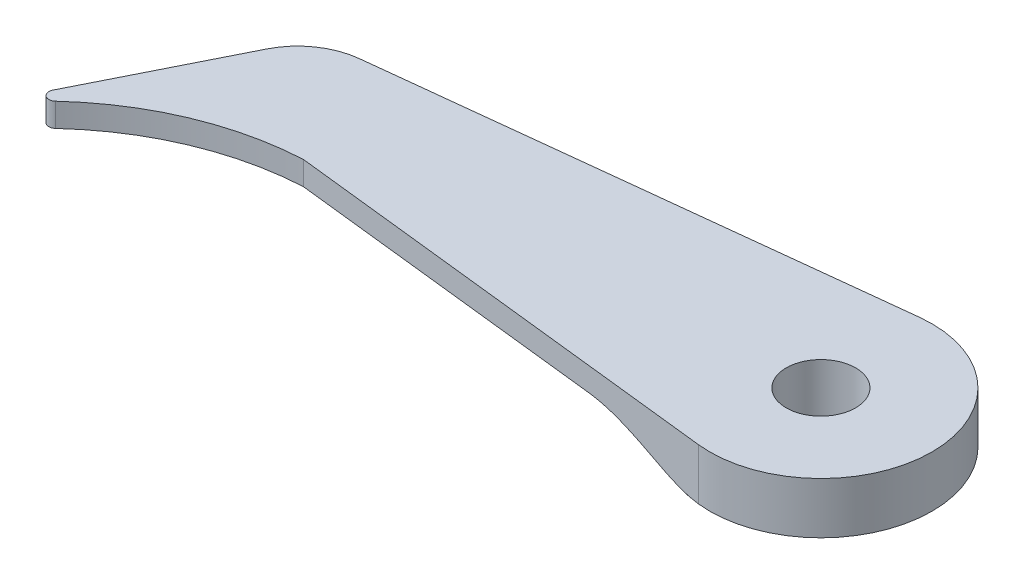
ISO-10303-21;
HEADER;
FILE_DESCRIPTION(('STEP AP214'),'2;1');
FILE_NAME('part.step','',(''),(''),'','','');
FILE_SCHEMA(('AUTOMOTIVE_DESIGN { 1 0 10303 214 1 1 1 1 }'));
ENDSEC;
DATA;
#1=APPLICATION_CONTEXT('core data for automotive mechanical design processes');
#2=APPLICATION_PROTOCOL_DEFINITION('international standard','automotive_design',2000,#1);
#3=PRODUCT_CONTEXT('',#1,'mechanical');
#4=PRODUCT('Part','Part','',(#3));
#5=PRODUCT_RELATED_PRODUCT_CATEGORY('part','',(#4));
#6=PRODUCT_DEFINITION_FORMATION('','',#4);
#7=PRODUCT_DEFINITION_CONTEXT('part definition',#1,'design');
#8=PRODUCT_DEFINITION('design','',#6,#7);
#9=PRODUCT_DEFINITION_SHAPE('','',#8);
#10=(LENGTH_UNIT() NAMED_UNIT(*) SI_UNIT(.MILLI.,.METRE.));
#11=(NAMED_UNIT(*) PLANE_ANGLE_UNIT() SI_UNIT($,.RADIAN.));
#12=(NAMED_UNIT(*) SI_UNIT($,.STERADIAN.) SOLID_ANGLE_UNIT());
#13=UNCERTAINTY_MEASURE_WITH_UNIT(LENGTH_MEASURE(1.E-05),#10,'distance_accuracy_value','');
#14=(GEOMETRIC_REPRESENTATION_CONTEXT(3) GLOBAL_UNCERTAINTY_ASSIGNED_CONTEXT((#13)) GLOBAL_UNIT_ASSIGNED_CONTEXT((#10,
#11,#12)) REPRESENTATION_CONTEXT('',''));
#15=CARTESIAN_POINT('',(0.,0.,0.));
#16=DIRECTION('',(0.,0.,1.));
#17=DIRECTION('',(1.,0.,0.));
#18=AXIS2_PLACEMENT_3D('',#15,#16,#17);
#19=CARTESIAN_POINT('',(0.,-4.699,0.));
#20=DIRECTION('',(0.,1.,0.));
#21=DIRECTION('',(0.,0.,1.));
#22=AXIS2_PLACEMENT_3D('',#19,#20,#21);
#23=CYLINDRICAL_SURFACE('',#22,10.16);
#24=DIRECTION('',(0.,1.,0.));
#25=VECTOR('',#24,1.);
#26=CARTESIAN_POINT('',(-1.12380115118108,-2.159,10.097656707009));
#27=LINE('',#26,#25);
#28=CARTESIAN_POINT('',(-1.12380115118108,-4.699,10.097656707009));
#29=VERTEX_POINT('',#28);
#30=CARTESIAN_POINT('',(-1.12380115118107,0.,10.097656707009));
#31=VERTEX_POINT('',#30);
#32=EDGE_CURVE('E132',#29,#31,#27,.T.);
#33=ORIENTED_EDGE('',*,*,#32,.F.);
#34=CARTESIAN_POINT('',(0.,-4.699,0.));
#35=DIRECTION('',(0.,1.,0.));
#36=DIRECTION('',(0.,0.,1.));
#37=AXIS2_PLACEMENT_3D('',#34,#35,#36);
#38=CIRCLE('',#37,10.16);
#39=CARTESIAN_POINT('',(-1.12380115118108,-4.699,-10.097656707009));
#40=VERTEX_POINT('',#39);
#41=EDGE_CURVE('E167',#29,#40,#38,.T.);
#42=ORIENTED_EDGE('',*,*,#41,.T.);
#43=DIRECTION('',(0.,1.,0.));
#44=VECTOR('',#43,1.);
#45=CARTESIAN_POINT('',(-1.12380115118108,-2.159,-10.097656707009));
#46=LINE('',#45,#44);
#47=CARTESIAN_POINT('',(-1.12380115118108,0.,-10.097656707009));
#48=VERTEX_POINT('',#47);
#49=EDGE_CURVE('E133',#40,#48,#46,.T.);
#50=ORIENTED_EDGE('',*,*,#49,.T.);
#51=CARTESIAN_POINT('',(0.,0.,0.));
#52=DIRECTION('',(0.,1.,0.));
#53=DIRECTION('',(0.,0.,1.));
#54=AXIS2_PLACEMENT_3D('',#51,#52,#53);
#55=CIRCLE('',#54,10.16);
#56=EDGE_CURVE('E161',#31,#48,#55,.T.);
#57=ORIENTED_EDGE('',*,*,#56,.F.);
#58=EDGE_LOOP('',(#33,#42,#50,#57));
#59=FACE_BOUND('',#58,.T.);
#60=ADVANCED_FACE('F45',(#59),#23,.T.);
#61=CARTESIAN_POINT('',(0.,-4.699,0.));
#62=DIRECTION('',(0.,1.,0.));
#63=DIRECTION('',(0.,0.,1.));
#64=AXIS2_PLACEMENT_3D('',#61,#62,#63);
#65=PLANE('',#64);
#66=CARTESIAN_POINT('',(0.,-4.699,0.));
#67=DIRECTION('',(0.,-1.,0.));
#68=DIRECTION('',(0.,0.,-1.));
#69=AXIS2_PLACEMENT_3D('',#66,#67,#68);
#70=CIRCLE('',#69,3.175);
#71=CARTESIAN_POINT('',(0.,-4.699,-3.175));
#72=VERTEX_POINT('',#71);
#73=EDGE_CURVE('E273',#72,#72,#70,.T.);
#74=ORIENTED_EDGE('',*,*,#73,.F.);
#75=EDGE_LOOP('',(#74));
#76=FACE_BOUND('',#75,.T.);
#77=EDGE_CURVE('E163',#40,#29,#38,.T.);
#78=ORIENTED_EDGE('',*,*,#77,.F.);
#79=ORIENTED_EDGE('',*,*,#41,.F.);
#80=EDGE_LOOP('',(#78,#79));
#81=FACE_BOUND('',#80,.T.);
#82=ADVANCED_FACE('F207',(#76,#81),#65,.F.);
#83=CARTESIAN_POINT('',(0.,0.,0.));
#84=DIRECTION('',(0.,1.,0.));
#85=DIRECTION('',(0.,0.,1.));
#86=AXIS2_PLACEMENT_3D('',#83,#84,#85);
#87=PLANE('',#86);
#88=CARTESIAN_POINT('',(0.,0.,0.));
#89=DIRECTION('',(0.,-1.,0.));
#90=DIRECTION('',(0.,0.,-1.));
#91=AXIS2_PLACEMENT_3D('',#88,#89,#90);
#92=CIRCLE('',#91,3.175);
#93=CARTESIAN_POINT('',(0.,0.,-3.175));
#94=VERTEX_POINT('',#93);
#95=EDGE_CURVE('E151',#94,#94,#92,.T.);
#96=ORIENTED_EDGE('',*,*,#95,.T.);
#97=EDGE_LOOP('',(#96));
#98=FACE_BOUND('',#97,.T.);
#99=DIRECTION('',(-0.993863849115061,0.,0.110610349525696));
#100=VECTOR('',#99,1.);
#101=CARTESIAN_POINT('',(-1.12380115118107,0.,-10.097656707009));
#102=LINE('',#101,#100);
#103=CARTESIAN_POINT('',(-47.2211640746857,0.,-4.96733082814572));
#104=VERTEX_POINT('',#103);
#105=EDGE_CURVE('E147',#48,#104,#102,.T.);
#106=ORIENTED_EDGE('',*,*,#105,.T.);
#107=CARTESIAN_POINT('',(-46.5187883551975,0.,1.34370461373491));
#108=DIRECTION('',(0.,1.,0.));
#109=DIRECTION('',(0.,0.,1.));
#110=AXIS2_PLACEMENT_3D('',#107,#108,#109);
#111=CIRCLE('',#110,6.35);
#112=CARTESIAN_POINT('',(-52.198401018047,0.,-1.49610171768982));
#113=VERTEX_POINT('',#112);
#114=EDGE_CURVE('E68',#104,#113,#111,.T.);
#115=ORIENTED_EDGE('',*,*,#114,.T.);
#116=DIRECTION('',(-0.447213595499958,0.,0.894427190999916));
#117=VECTOR('',#116,1.);
#118=CARTESIAN_POINT('',(-42.3571615015135,0.,-21.1785807507568));
#119=LINE('',#118,#117);
#120=CARTESIAN_POINT('',(-58.721971796448,0.,11.5510398391123));
#121=VERTEX_POINT('',#120);
#122=EDGE_CURVE('E150',#113,#121,#119,.T.);
#123=ORIENTED_EDGE('',*,*,#122,.T.);
#124=CARTESIAN_POINT('',(-58.1540105301631,0.,11.8350204722548));
#125=DIRECTION('',(0.,1.,0.));
#126=DIRECTION('',(0.,0.,1.));
#127=AXIS2_PLACEMENT_3D('',#124,#125,#126);
#128=CIRCLE('',#127,0.635);
#129=CARTESIAN_POINT('',(-57.7226707194551,0.,12.3010365317403));
#130=VERTEX_POINT('',#129);
#131=EDGE_CURVE('E230',#121,#130,#128,.T.);
#132=ORIENTED_EDGE('',*,*,#131,.T.);
#133=CARTESIAN_POINT('',(-40.4690782911367,0.,30.9416789111615));
#134=DIRECTION('',(0.,1.,0.));
#135=DIRECTION('',(0.,0.,1.));
#136=AXIS2_PLACEMENT_3D('',#133,#134,#135);
#137=CIRCLE('',#136,25.4);
#138=CARTESIAN_POINT('',(-41.7638011511811,0.,5.57469854857835));
#139=VERTEX_POINT('',#138);
#140=EDGE_CURVE('E154',#130,#139,#137,.F.);
#141=ORIENTED_EDGE('',*,*,#140,.T.);
#142=DIRECTION('',(0.99386384911506,0.,0.110610349525696));
#143=VECTOR('',#142,1.);
#144=CARTESIAN_POINT('',(-1.12380115118107,0.,10.097656707009));
#145=LINE('',#144,#143);
#146=EDGE_CURVE('E130',#139,#31,#145,.T.);
#147=ORIENTED_EDGE('',*,*,#146,.T.);
#148=ORIENTED_EDGE('',*,*,#56,.T.);
#149=EDGE_LOOP('',(#106,#115,#123,#132,#141,#147,#148));
#150=FACE_BOUND('',#149,.T.);
#151=ADVANCED_FACE('F196',(#98,#150),#87,.T.);
#152=CARTESIAN_POINT('',(-1.12380115118107,-2.159,10.097656707009));
#153=DIRECTION('',(-0.110610349525696,0.,0.99386384911506));
#154=DIRECTION('',(0.99386384911506,0.,0.110610349525696));
#155=AXIS2_PLACEMENT_3D('',#152,#153,#154);
#156=PLANE('',#155);
#157=ORIENTED_EDGE('',*,*,#146,.F.);
#158=DIRECTION('',(0.,1.,0.));
#159=VECTOR('',#158,1.);
#160=CARTESIAN_POINT('',(-41.7638011511811,-2.159,5.57469854857835));
#161=LINE('',#160,#159);
#162=CARTESIAN_POINT('',(-41.7638011511811,-2.159,5.57469854857835));
#163=VERTEX_POINT('',#162);
#164=EDGE_CURVE('E113',#163,#139,#161,.T.);
#165=ORIENTED_EDGE('',*,*,#164,.F.);
#166=DIRECTION('',(0.99386384911506,0.,0.110610349525696));
#167=VECTOR('',#166,1.);
#168=CARTESIAN_POINT('',(-1.12380115118107,-2.159,10.097656707009));
#169=LINE('',#168,#167);
#170=CARTESIAN_POINT('',(-12.4133245563455,-2.159,8.84120882339234));
#171=VERTEX_POINT('',#170);
#172=EDGE_CURVE('E122',#163,#171,#169,.T.);
#173=ORIENTED_EDGE('',*,*,#172,.T.);
#174=CARTESIAN_POINT('',(-12.4133245563455,-2.159,8.84120882339234));
#175=CARTESIAN_POINT('',(-12.215631589338,-2.15899944483401,8.86321071852007));
#176=CARTESIAN_POINT('',(-12.0179955342661,-2.16419253242717,8.88520627973285));
#177=CARTESIAN_POINT('',(-11.6232909628689,-2.18421377565675,8.92913423892013));
#178=CARTESIAN_POINT('',(-11.4262222280699,-2.19903751739655,8.95106666120927));
#179=CARTESIAN_POINT('',(-10.8375185894452,-2.25671326645814,9.01658540936909));
#180=CARTESIAN_POINT('',(-10.4471323426445,-2.31277944253989,9.06003276812663));
#181=CARTESIAN_POINT('',(-9.6728004882155,-2.4537972936083,9.14621068590031));
#182=CARTESIAN_POINT('',(-9.28884096604368,-2.53867475314458,9.18894279351139));
#183=CARTESIAN_POINT('',(-8.52620873905635,-2.73102164829005,9.27381862158557));
#184=CARTESIAN_POINT('',(-8.14754240657106,-2.83851616909003,9.31596163285125));
#185=CARTESIAN_POINT('',(-7.4976701144355,-3.03759659879908,9.38828803997853));
#186=CARTESIAN_POINT('',(-7.22532847522932,-3.12552298728225,9.41859782932223));
#187=CARTESIAN_POINT('',(-6.68238382025268,-3.30657411044288,9.47902391093647));
#188=CARTESIAN_POINT('',(-6.41178073355932,-3.39969863154564,9.50914021110026));
#189=CARTESIAN_POINT('',(-5.87176823655195,-3.58746916238242,9.56923996329007));
#190=CARTESIAN_POINT('',(-5.60235750996171,-3.68211140068152,9.59922356180878));
#191=CARTESIAN_POINT('',(-5.06255570715141,-3.86896856499078,9.65929986515416));
#192=CARTESIAN_POINT('',(-4.79216422836514,-3.96118232470455,9.68939261478375));
#193=CARTESIAN_POINT('',(-4.24672030691762,-4.13855938468928,9.75009684791558));
#194=CARTESIAN_POINT('',(-3.9716480117887,-4.22366302129697,9.7807105408637));
#195=CARTESIAN_POINT('',(-3.55615081837915,-4.34023514913737,9.82695257877553));
#196=CARTESIAN_POINT('',(-3.41726806545791,-4.37722338281344,9.84240929335206));
#197=CARTESIAN_POINT('',(-3.13834566446523,-4.44655320188337,9.87345147713993));
#198=CARTESIAN_POINT('',(-2.99830597842217,-4.47889463411903,9.88903695057725));
#199=CARTESIAN_POINT('',(-2.71553594297183,-4.53824368001149,9.92050735015401));
#200=CARTESIAN_POINT('',(-2.57279283856326,-4.56519048071177,9.93639369583916));
#201=CARTESIAN_POINT('',(-2.28621994018233,-4.61230984096591,9.96828732843555));
#202=CARTESIAN_POINT('',(-2.14239035375425,-4.63248366245474,9.98429459224851));
#203=CARTESIAN_POINT('',(-1.85306684472384,-4.66527260595802,10.0164943492759));
#204=CARTESIAN_POINT('',(-1.70756811929457,-4.6778455615587,10.0326873770127));
#205=CARTESIAN_POINT('',(-1.41598932869892,-4.6947471297837,10.0651381316817));
#206=CARTESIAN_POINT('',(-1.26990889900938,-4.6990693135045,10.081395899183));
#207=CARTESIAN_POINT('',(-1.12380115118088,-4.69899999999935,10.0976567070091));
#208=B_SPLINE_CURVE_WITH_KNOTS('',3,(#174,#175,#176,#177,#178,#179,#180,#181,#182,#183,#184,
#185,#186,#187,#188,#189,#190,#191,#192,#193,#194,#195,#196,#197,#198,#199,#200,#201,#202,#203,
#204,#205,#206,#207),.UNSPECIFIED.,.F.,.F.,(4,2,2,2,2,2,2,2,2,2,2,2,2,2,2,2,4),(0.,
0.596579833297239,1.19288643636408,2.38172950360219,3.56753316145318,4.75465902527816,
5.61794626637801,6.48119806382766,7.34256258860509,8.20433351322747,9.07273068980575,
9.50632548407894,9.9399345663246,10.3781860235732,10.8163557808583,11.2569345318153,
11.6978564366044),.UNSPECIFIED.);
#209=EDGE_CURVE('E173',#171,#29,#208,.T.);
#210=ORIENTED_EDGE('',*,*,#209,.T.);
#211=ORIENTED_EDGE('',*,*,#32,.T.);
#212=EDGE_LOOP('',(#157,#165,#173,#210,#211));
#213=FACE_BOUND('',#212,.T.);
#214=ADVANCED_FACE('F127',(#213),#156,.T.);
#215=CARTESIAN_POINT('',(-40.4690782911367,-2.159,30.9416789111615));
#216=DIRECTION('',(0.,1.,0.));
#217=DIRECTION('',(0.,0.,1.));
#218=AXIS2_PLACEMENT_3D('',#215,#216,#217);
#219=CYLINDRICAL_SURFACE('',#218,25.4);
#220=ORIENTED_EDGE('',*,*,#140,.F.);
#221=DIRECTION('',(0.,1.,0.));
#222=VECTOR('',#221,1.);
#223=CARTESIAN_POINT('',(-57.7226707194551,-2.159,12.3010365317403));
#224=LINE('',#223,#222);
#225=CARTESIAN_POINT('',(-57.7226707194551,-2.159,12.3010365317403));
#226=VERTEX_POINT('',#225);
#227=EDGE_CURVE('E116',#130,#226,#224,.F.);
#228=ORIENTED_EDGE('',*,*,#227,.T.);
#229=CARTESIAN_POINT('',(-40.4690782911367,-2.159,30.9416789111615));
#230=DIRECTION('',(0.,1.,0.));
#231=DIRECTION('',(0.,0.,1.));
#232=AXIS2_PLACEMENT_3D('',#229,#230,#231);
#233=CIRCLE('',#232,25.4);
#234=EDGE_CURVE('E109',#226,#163,#233,.F.);
#235=ORIENTED_EDGE('',*,*,#234,.T.);
#236=ORIENTED_EDGE('',*,*,#164,.T.);
#237=EDGE_LOOP('',(#220,#228,#235,#236));
#238=FACE_BOUND('',#237,.T.);
#239=ADVANCED_FACE('F112',(#238),#219,.F.);
#240=CARTESIAN_POINT('',(-42.3571615015135,-2.159,-21.1785807507568));
#241=DIRECTION('',(-0.894427190999916,0.,-0.447213595499958));
#242=DIRECTION('',(-0.447213595499958,0.,0.894427190999916));
#243=AXIS2_PLACEMENT_3D('',#240,#241,#242);
#244=PLANE('',#243);
#245=ORIENTED_EDGE('',*,*,#122,.F.);
#246=DIRECTION('',(0.,1.,0.));
#247=VECTOR('',#246,1.);
#248=CARTESIAN_POINT('',(-52.198401018047,-2.159,-1.49610171768982));
#249=LINE('',#248,#247);
#250=CARTESIAN_POINT('',(-52.198401018047,-2.159,-1.49610171768982));
#251=VERTEX_POINT('',#250);
#252=EDGE_CURVE('E54',#113,#251,#249,.F.);
#253=ORIENTED_EDGE('',*,*,#252,.T.);
#254=DIRECTION('',(-0.447213595499958,0.,0.894427190999916));
#255=VECTOR('',#254,1.);
#256=CARTESIAN_POINT('',(-42.3571615015135,-2.159,-21.1785807507568));
#257=LINE('',#256,#255);
#258=CARTESIAN_POINT('',(-58.721971796448,-2.159,11.5510398391123));
#259=VERTEX_POINT('',#258);
#260=EDGE_CURVE('E123',#251,#259,#257,.T.);
#261=ORIENTED_EDGE('',*,*,#260,.T.);
#262=DIRECTION('',(0.,1.,0.));
#263=VECTOR('',#262,1.);
#264=CARTESIAN_POINT('',(-58.721971796448,-2.159,11.5510398391123));
#265=LINE('',#264,#263);
#266=EDGE_CURVE('E227',#259,#121,#265,.T.);
#267=ORIENTED_EDGE('',*,*,#266,.T.);
#268=EDGE_LOOP('',(#245,#253,#261,#267));
#269=FACE_BOUND('',#268,.T.);
#270=ADVANCED_FACE('F200',(#269),#244,.T.);
#271=CARTESIAN_POINT('',(-1.12380115118107,-2.159,-10.097656707009));
#272=DIRECTION('',(-0.110610349525696,0.,-0.99386384911506));
#273=DIRECTION('',(-0.993863849115061,0.,0.110610349525696));
#274=AXIS2_PLACEMENT_3D('',#271,#272,#273);
#275=PLANE('',#274);
#276=DIRECTION('',(-0.993863849115061,0.,0.110610349525696));
#277=VECTOR('',#276,1.);
#278=CARTESIAN_POINT('',(-1.12380115118107,-2.159,-10.097656707009));
#279=LINE('',#278,#277);
#280=CARTESIAN_POINT('',(-12.4133245563455,-2.159,-8.84120882339234));
#281=VERTEX_POINT('',#280);
#282=CARTESIAN_POINT('',(-47.2211640746857,-2.159,-4.96733082814572));
#283=VERTEX_POINT('',#282);
#284=EDGE_CURVE('E159',#281,#283,#279,.T.);
#285=ORIENTED_EDGE('',*,*,#284,.T.);
#286=DIRECTION('',(0.,1.,0.));
#287=VECTOR('',#286,1.);
#288=CARTESIAN_POINT('',(-47.2211640746857,-2.159,-4.96733082814572));
#289=LINE('',#288,#287);
#290=EDGE_CURVE('E240',#283,#104,#289,.T.);
#291=ORIENTED_EDGE('',*,*,#290,.T.);
#292=ORIENTED_EDGE('',*,*,#105,.F.);
#293=ORIENTED_EDGE('',*,*,#49,.F.);
#294=CARTESIAN_POINT('',(-1.12380115118108,-4.699,-10.097656707009));
#295=CARTESIAN_POINT('',(-1.25857980300781,-4.69905100028381,-10.0826567512299));
#296=CARTESIAN_POINT('',(-1.39334006175411,-4.69538104571616,-10.0676588424768));
#297=CARTESIAN_POINT('',(-1.66241091119582,-4.68098300250122,-10.0377130699945));
#298=CARTESIAN_POINT('',(-1.79672172048221,-4.67025908421576,-10.0227651819378));
#299=CARTESIAN_POINT('',(-2.06383741130875,-4.64222038085417,-9.99303700543509));
#300=CARTESIAN_POINT('',(-2.19664649351803,-4.62494550844278,-9.97825624948302));
#301=CARTESIAN_POINT('',(-2.46137571547298,-4.58445387258504,-9.94879367088518));
#302=CARTESIAN_POINT('',(-2.5932957300061,-4.56123628942721,-9.93411186217472));
#303=CARTESIAN_POINT('',(-2.85605807807075,-4.50963318139744,-9.90486818338763));
#304=CARTESIAN_POINT('',(-2.9869008943249,-4.4812501197441,-9.89030625958722));
#305=CARTESIAN_POINT('',(-3.24756466398273,-4.42012049864893,-9.86129613843611));
#306=CARTESIAN_POINT('',(-3.37738563235099,-4.38737400323429,-9.84684793941995));
#307=CARTESIAN_POINT('',(-3.63636318732701,-4.31824058218961,-9.81802548260083));
#308=CARTESIAN_POINT('',(-3.76551769989354,-4.28184585125577,-9.80365145562467));
#309=CARTESIAN_POINT('',(-4.02299858193114,-4.20623375068161,-9.77499556841867));
#310=CARTESIAN_POINT('',(-4.1513249733019,-4.16701645602013,-9.76071370575154));
#311=CARTESIAN_POINT('',(-4.44536417851666,-4.07447878386528,-9.72798912351422));
#312=CARTESIAN_POINT('',(-4.61084991211753,-4.02043178539082,-9.70957167644498));
#313=CARTESIAN_POINT('',(-4.94108245075282,-3.91010117246797,-9.67281902007687));
#314=CARTESIAN_POINT('',(-5.10582922846721,-3.85381747607256,-9.65448381381854));
#315=CARTESIAN_POINT('',(-5.43498232004476,-3.74016764272678,-9.61785129263441));
#316=CARTESIAN_POINT('',(-5.59938857256845,-3.68280132688142,-9.59955398453527));
#317=CARTESIAN_POINT('',(-5.92817770660467,-3.56800089849434,-9.56296196937305));
#318=CARTESIAN_POINT('',(-6.09256058797271,-3.51056678555231,-9.54466726232606));
#319=CARTESIAN_POINT('',(-6.5852372853171,-3.33983376716684,-9.48983566567934));
#320=CARTESIAN_POINT('',(-6.91396459963436,-3.22778007026565,-9.45325053063529));
#321=CARTESIAN_POINT('',(-7.57442964331676,-3.01302565742512,-9.37974522163722));
#322=CARTESIAN_POINT('',(-7.90616681397183,-2.91032324317573,-9.34282510986387));
#323=CARTESIAN_POINT('',(-8.40848892712214,-2.76661166423382,-9.28692004343096));
#324=CARTESIAN_POINT('',(-8.57755205692555,-2.72023097580425,-9.26810445626968));
#325=CARTESIAN_POINT('',(-8.91678214230896,-2.63174576178501,-9.23035043357603));
#326=CARTESIAN_POINT('',(-9.08694911829502,-2.58964131548843,-9.2114119957726));
#327=CARTESIAN_POINT('',(-9.59895247110335,-2.47067326916928,-9.15442947260015));
#328=CARTESIAN_POINT('',(-9.94250871458515,-2.40109119829538,-9.11619397766078));
#329=CARTESIAN_POINT('',(-10.6388151530307,-2.28505182374469,-9.03869976293304));
#330=CARTESIAN_POINT('',(-10.9916261707226,-2.23895188357333,-8.99943427398488));
#331=CARTESIAN_POINT('',(-11.7005938344948,-2.17587581430387,-8.9205309501925));
#332=CARTESIAN_POINT('',(-12.0567564262488,-2.15896893669556,-8.88089245363489));
#333=CARTESIAN_POINT('',(-12.4133245563455,-2.159,-8.84120882339234));
#334=B_SPLINE_CURVE_WITH_KNOTS('',3,(#294,#295,#296,#297,#298,#299,#300,#301,#302,#303,#304,
#305,#306,#307,#308,#309,#310,#311,#312,#313,#314,#315,#316,#317,#318,#319,#320,#321,#322,#323,
#324,#325,#326,#327,#328,#329,#330,#331,#332,#333),.UNSPECIFIED.,.F.,.F.,(4,2,2,2,2,2,2,2,2,2,2,
2,2,2,2,2,2,2,2,4),(0.,0.406753034431081,0.813265808973999,1.21734063193988,1.62147122127992,
2.02540959880516,2.42934204976087,2.83415793660625,3.23896307384863,3.76411305102517,
4.28928228615555,4.81453907499523,5.33979898083814,6.38741789114085,7.43484615964398,
7.9637456824921,8.49265501077902,9.54979090990106,10.6225672024152,11.6978848457013),.UNSPECIFIED.);
#335=EDGE_CURVE('E182',#40,#281,#334,.T.);
#336=ORIENTED_EDGE('',*,*,#335,.T.);
#337=EDGE_LOOP('',(#285,#291,#292,#293,#336));
#338=FACE_BOUND('',#337,.T.);
#339=ADVANCED_FACE('F202',(#338),#275,.T.);
#340=CARTESIAN_POINT('',(0.,-2.159,0.));
#341=DIRECTION('',(0.,1.,0.));
#342=DIRECTION('',(0.,0.,1.));
#343=AXIS2_PLACEMENT_3D('',#340,#341,#342);
#344=PLANE('',#343);
#345=ORIENTED_EDGE('',*,*,#260,.F.);
#346=CARTESIAN_POINT('',(-46.5187883551975,-2.159,1.34370461373491));
#347=DIRECTION('',(0.,1.,0.));
#348=DIRECTION('',(0.,0.,1.));
#349=AXIS2_PLACEMENT_3D('',#346,#347,#348);
#350=CIRCLE('',#349,6.35);
#351=EDGE_CURVE('E11',#251,#283,#350,.F.);
#352=ORIENTED_EDGE('',*,*,#351,.T.);
#353=ORIENTED_EDGE('',*,*,#284,.F.);
#354=CARTESIAN_POINT('',(0.,-2.159,0.));
#355=DIRECTION('',(0.,1.,0.));
#356=DIRECTION('',(0.,0.,1.));
#357=AXIS2_PLACEMENT_3D('',#354,#355,#356);
#358=CIRCLE('',#357,15.24);
#359=EDGE_CURVE('E139',#281,#171,#358,.T.);
#360=ORIENTED_EDGE('',*,*,#359,.T.);
#361=ORIENTED_EDGE('',*,*,#172,.F.);
#362=ORIENTED_EDGE('',*,*,#234,.F.);
#363=CARTESIAN_POINT('',(-58.1540105301631,-2.159,11.8350204722548));
#364=DIRECTION('',(0.,1.,0.));
#365=DIRECTION('',(0.,0.,1.));
#366=AXIS2_PLACEMENT_3D('',#363,#364,#365);
#367=CIRCLE('',#366,0.635);
#368=EDGE_CURVE('E237',#226,#259,#367,.F.);
#369=ORIENTED_EDGE('',*,*,#368,.T.);
#370=EDGE_LOOP('',(#345,#352,#353,#360,#361,#362,#369));
#371=FACE_BOUND('',#370,.T.);
#372=ADVANCED_FACE('F136',(#371),#344,.F.);
#373=CARTESIAN_POINT('',(0.,0.,0.));
#374=DIRECTION('',(0.,-1.,0.));
#375=DIRECTION('',(0.,0.,-1.));
#376=AXIS2_PLACEMENT_3D('',#373,#374,#375);
#377=CYLINDRICAL_SURFACE('',#376,3.175);
#378=ORIENTED_EDGE('',*,*,#95,.F.);
#379=EDGE_LOOP('',(#378));
#380=FACE_BOUND('',#379,.T.);
#381=ORIENTED_EDGE('',*,*,#73,.T.);
#382=EDGE_LOOP('',(#381));
#383=FACE_BOUND('',#382,.T.);
#384=ADVANCED_FACE('F260',(#380,#383),#377,.F.);
#385=CARTESIAN_POINT('',(0.,-8.509,0.));
#386=DIRECTION('',(0.,1.,0.));
#387=DIRECTION('',(0.,0.,1.));
#388=AXIS2_PLACEMENT_3D('',#385,#386,#387);
#389=TOROIDAL_SURFACE('',#388,15.24,6.35);
#390=ORIENTED_EDGE('',*,*,#335,.F.);
#391=ORIENTED_EDGE('',*,*,#77,.T.);
#392=ORIENTED_EDGE('',*,*,#209,.F.);
#393=ORIENTED_EDGE('',*,*,#359,.F.);
#394=EDGE_LOOP('',(#390,#391,#392,#393));
#395=FACE_BOUND('',#394,.T.);
#396=ADVANCED_FACE('F189',(#395),#389,.F.);
#397=CARTESIAN_POINT('',(-58.1540105301631,-2.159,11.8350204722548));
#398=DIRECTION('',(0.,1.,0.));
#399=DIRECTION('',(0.,0.,1.));
#400=AXIS2_PLACEMENT_3D('',#397,#398,#399);
#401=CYLINDRICAL_SURFACE('',#400,0.635);
#402=ORIENTED_EDGE('',*,*,#368,.F.);
#403=ORIENTED_EDGE('',*,*,#227,.F.);
#404=ORIENTED_EDGE('',*,*,#131,.F.);
#405=ORIENTED_EDGE('',*,*,#266,.F.);
#406=EDGE_LOOP('',(#402,#403,#404,#405));
#407=FACE_BOUND('',#406,.T.);
#408=ADVANCED_FACE('F251',(#407),#401,.T.);
#409=CARTESIAN_POINT('',(-46.5187883551975,-2.159,1.34370461373491));
#410=DIRECTION('',(0.,1.,0.));
#411=DIRECTION('',(0.,0.,1.));
#412=AXIS2_PLACEMENT_3D('',#409,#410,#411);
#413=CYLINDRICAL_SURFACE('',#412,6.35);
#414=ORIENTED_EDGE('',*,*,#351,.F.);
#415=ORIENTED_EDGE('',*,*,#252,.F.);
#416=ORIENTED_EDGE('',*,*,#114,.F.);
#417=ORIENTED_EDGE('',*,*,#290,.F.);
#418=EDGE_LOOP('',(#414,#415,#416,#417));
#419=FACE_BOUND('',#418,.T.);
#420=ADVANCED_FACE('F47',(#419),#413,.T.);
#421=CLOSED_SHELL('',(#60,#82,#151,#214,#239,#270,#339,#372,#384,#396,#408,#420));
#422=MANIFOLD_SOLID_BREP('B2',#421);
#423=ADVANCED_BREP_SHAPE_REPRESENTATION('',(#18,#422),#14);
#424=SHAPE_DEFINITION_REPRESENTATION(#9,#423);
ENDSEC;
END-ISO-10303-21;
